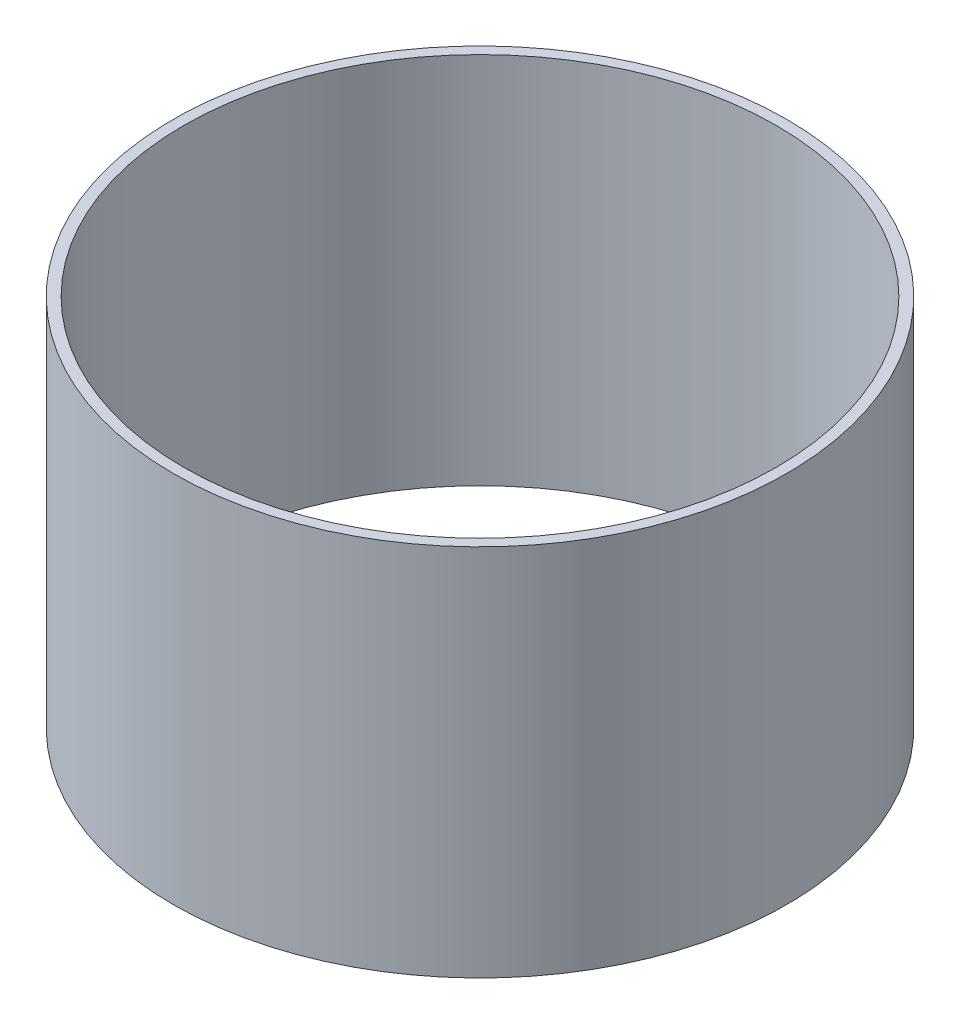
ISO-10303-21;
HEADER;
FILE_DESCRIPTION(('STEP AP214'),'2;1');
FILE_NAME('part.step','',(''),(''),'','','');
FILE_SCHEMA(('AUTOMOTIVE_DESIGN { 1 0 10303 214 1 1 1 1 }'));
ENDSEC;
DATA;
#1=APPLICATION_CONTEXT('core data for automotive mechanical design processes');
#2=APPLICATION_PROTOCOL_DEFINITION('international standard','automotive_design',2000,#1);
#3=PRODUCT_CONTEXT('',#1,'mechanical');
#4=PRODUCT('Part','Part','',(#3));
#5=PRODUCT_RELATED_PRODUCT_CATEGORY('part','',(#4));
#6=PRODUCT_DEFINITION_FORMATION('','',#4);
#7=PRODUCT_DEFINITION_CONTEXT('part definition',#1,'design');
#8=PRODUCT_DEFINITION('design','',#6,#7);
#9=PRODUCT_DEFINITION_SHAPE('','',#8);
#10=(LENGTH_UNIT() NAMED_UNIT(*) SI_UNIT(.MILLI.,.METRE.));
#11=(NAMED_UNIT(*) PLANE_ANGLE_UNIT() SI_UNIT($,.RADIAN.));
#12=(NAMED_UNIT(*) SI_UNIT($,.STERADIAN.) SOLID_ANGLE_UNIT());
#13=UNCERTAINTY_MEASURE_WITH_UNIT(LENGTH_MEASURE(1.E-05),#10,'distance_accuracy_value','');
#14=(GEOMETRIC_REPRESENTATION_CONTEXT(3) GLOBAL_UNCERTAINTY_ASSIGNED_CONTEXT((#13)) GLOBAL_UNIT_ASSIGNED_CONTEXT((#10,
#11,#12)) REPRESENTATION_CONTEXT('',''));
#15=CARTESIAN_POINT('',(0.,0.,0.));
#16=DIRECTION('',(0.,0.,1.));
#17=DIRECTION('',(1.,0.,0.));
#18=AXIS2_PLACEMENT_3D('',#15,#16,#17);
#19=CARTESIAN_POINT('',(0.,66.675,0.));
#20=DIRECTION('',(0.,1.,0.));
#21=DIRECTION('',(0.,0.,1.));
#22=AXIS2_PLACEMENT_3D('',#19,#20,#21);
#23=PLANE('',#22);
#24=CARTESIAN_POINT('',(0.,66.675,0.));
#25=DIRECTION('',(0.,1.,0.));
#26=DIRECTION('',(0.,0.,1.));
#27=AXIS2_PLACEMENT_3D('',#24,#25,#26);
#28=CIRCLE('',#27,109.5375);
#29=CARTESIAN_POINT('',(0.,66.675,109.5375));
#30=VERTEX_POINT('',#29);
#31=EDGE_CURVE('E10',#30,#30,#28,.T.);
#32=ORIENTED_EDGE('',*,*,#31,.T.);
#33=EDGE_LOOP('',(#32));
#34=FACE_BOUND('',#33,.T.);
#35=CARTESIAN_POINT('',(0.,66.675,0.));
#36=DIRECTION('',(0.,1.,0.));
#37=DIRECTION('',(0.,0.,1.));
#38=AXIS2_PLACEMENT_3D('',#35,#36,#37);
#39=CIRCLE('',#38,105.7783);
#40=CARTESIAN_POINT('',(0.,66.675,105.7783));
#41=VERTEX_POINT('',#40);
#42=EDGE_CURVE('E50',#41,#41,#39,.T.);
#43=ORIENTED_EDGE('',*,*,#42,.F.);
#44=EDGE_LOOP('',(#43));
#45=FACE_BOUND('',#44,.T.);
#46=ADVANCED_FACE('F37',(#34,#45),#23,.T.);
#47=CARTESIAN_POINT('',(0.,-66.675,0.));
#48=DIRECTION('',(0.,1.,0.));
#49=DIRECTION('',(0.,0.,1.));
#50=AXIS2_PLACEMENT_3D('',#47,#48,#49);
#51=PLANE('',#50);
#52=CARTESIAN_POINT('',(0.,-66.675,0.));
#53=DIRECTION('',(0.,1.,0.));
#54=DIRECTION('',(0.,0.,1.));
#55=AXIS2_PLACEMENT_3D('',#52,#53,#54);
#56=CIRCLE('',#55,109.5375);
#57=CARTESIAN_POINT('',(0.,-66.675,109.5375));
#58=VERTEX_POINT('',#57);
#59=EDGE_CURVE('E41',#58,#58,#56,.T.);
#60=ORIENTED_EDGE('',*,*,#59,.F.);
#61=EDGE_LOOP('',(#60));
#62=FACE_BOUND('',#61,.T.);
#63=CARTESIAN_POINT('',(0.,-66.675,0.));
#64=DIRECTION('',(0.,1.,0.));
#65=DIRECTION('',(0.,0.,1.));
#66=AXIS2_PLACEMENT_3D('',#63,#64,#65);
#67=CIRCLE('',#66,105.7783);
#68=CARTESIAN_POINT('',(0.,-66.675,105.7783));
#69=VERTEX_POINT('',#68);
#70=EDGE_CURVE('E52',#69,#69,#67,.T.);
#71=ORIENTED_EDGE('',*,*,#70,.T.);
#72=EDGE_LOOP('',(#71));
#73=FACE_BOUND('',#72,.T.);
#74=ADVANCED_FACE('F64',(#62,#73),#51,.F.);
#75=CARTESIAN_POINT('',(0.,66.675,0.));
#76=DIRECTION('',(0.,-1.,0.));
#77=DIRECTION('',(0.,0.,-1.));
#78=AXIS2_PLACEMENT_3D('',#75,#76,#77);
#79=CYLINDRICAL_SURFACE('',#78,109.5375);
#80=ORIENTED_EDGE('',*,*,#31,.F.);
#81=EDGE_LOOP('',(#80));
#82=FACE_BOUND('',#81,.T.);
#83=ORIENTED_EDGE('',*,*,#59,.T.);
#84=EDGE_LOOP('',(#83));
#85=FACE_BOUND('',#84,.T.);
#86=ADVANCED_FACE('F39',(#82,#85),#79,.T.);
#87=CARTESIAN_POINT('',(0.,66.675,0.));
#88=DIRECTION('',(0.,-1.,0.));
#89=DIRECTION('',(0.,0.,-1.));
#90=AXIS2_PLACEMENT_3D('',#87,#88,#89);
#91=CYLINDRICAL_SURFACE('',#90,105.7783);
#92=ORIENTED_EDGE('',*,*,#42,.T.);
#93=EDGE_LOOP('',(#92));
#94=FACE_BOUND('',#93,.T.);
#95=ORIENTED_EDGE('',*,*,#70,.F.);
#96=EDGE_LOOP('',(#95));
#97=FACE_BOUND('',#96,.T.);
#98=ADVANCED_FACE('F60',(#94,#97),#91,.F.);
#99=CLOSED_SHELL('',(#46,#74,#86,#98));
#100=MANIFOLD_SOLID_BREP('B2',#99);
#101=ADVANCED_BREP_SHAPE_REPRESENTATION('',(#18,#100),#14);
#102=SHAPE_DEFINITION_REPRESENTATION(#9,#101);
ENDSEC;
END-ISO-10303-21;
